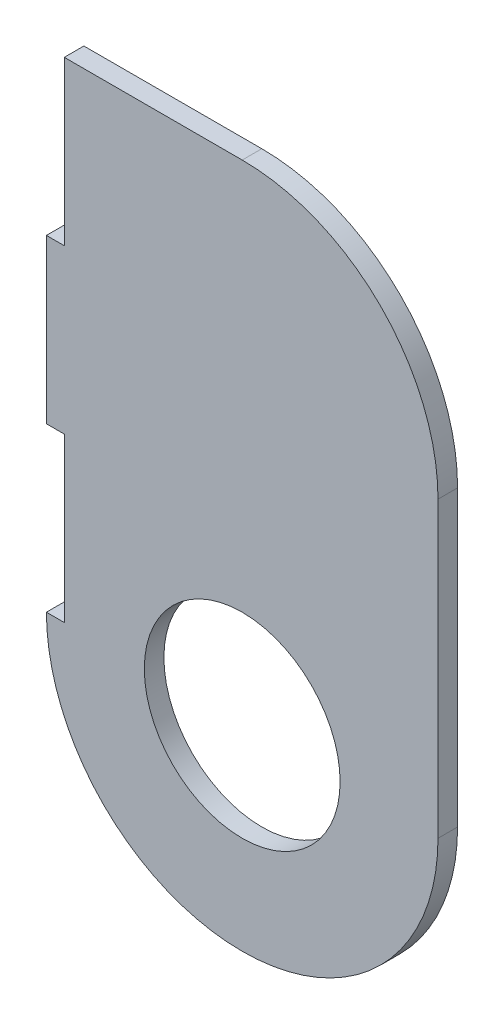
ISO-10303-21;
HEADER;
FILE_DESCRIPTION(('STEP AP214'),'2;1');
FILE_NAME('part.step','',(''),(''),'','','');
FILE_SCHEMA(('AUTOMOTIVE_DESIGN { 1 0 10303 214 1 1 1 1 }'));
ENDSEC;
DATA;
#1=APPLICATION_CONTEXT('core data for automotive mechanical design processes');
#2=APPLICATION_PROTOCOL_DEFINITION('international standard','automotive_design',2000,#1);
#3=PRODUCT_CONTEXT('',#1,'mechanical');
#4=PRODUCT('Part','Part','',(#3));
#5=PRODUCT_RELATED_PRODUCT_CATEGORY('part','',(#4));
#6=PRODUCT_DEFINITION_FORMATION('','',#4);
#7=PRODUCT_DEFINITION_CONTEXT('part definition',#1,'design');
#8=PRODUCT_DEFINITION('design','',#6,#7);
#9=PRODUCT_DEFINITION_SHAPE('','',#8);
#10=(LENGTH_UNIT() NAMED_UNIT(*) SI_UNIT(.MILLI.,.METRE.));
#11=(NAMED_UNIT(*) PLANE_ANGLE_UNIT() SI_UNIT($,.RADIAN.));
#12=(NAMED_UNIT(*) SI_UNIT($,.STERADIAN.) SOLID_ANGLE_UNIT());
#13=UNCERTAINTY_MEASURE_WITH_UNIT(LENGTH_MEASURE(1.E-05),#10,'distance_accuracy_value','');
#14=(GEOMETRIC_REPRESENTATION_CONTEXT(3) GLOBAL_UNCERTAINTY_ASSIGNED_CONTEXT((#13)) GLOBAL_UNIT_ASSIGNED_CONTEXT((#10,
#11,#12)) REPRESENTATION_CONTEXT('',''));
#15=CARTESIAN_POINT('',(0.,0.,0.));
#16=DIRECTION('',(0.,0.,1.));
#17=DIRECTION('',(1.,0.,0.));
#18=AXIS2_PLACEMENT_3D('',#15,#16,#17);
#19=CARTESIAN_POINT('',(0.,0.,3.));
#20=DIRECTION('',(1.,0.,0.));
#21=DIRECTION('',(0.,0.,-1.));
#22=AXIS2_PLACEMENT_3D('',#19,#20,#21);
#23=PLANE('',#22);
#24=DIRECTION('',(0.,-1.,0.));
#25=VECTOR('',#24,1.);
#26=CARTESIAN_POINT('',(0.,0.,0.));
#27=LINE('',#26,#25);
#28=CARTESIAN_POINT('',(0.,80.,0.));
#29=VERTEX_POINT('',#28);
#30=CARTESIAN_POINT('',(0.,55.,0.));
#31=VERTEX_POINT('',#30);
#32=EDGE_CURVE('E197',#29,#31,#27,.T.);
#33=ORIENTED_EDGE('',*,*,#32,.T.);
#34=DIRECTION('',(0.,0.,1.));
#35=VECTOR('',#34,1.);
#36=CARTESIAN_POINT('',(0.,55.,0.));
#37=LINE('',#36,#35);
#38=CARTESIAN_POINT('',(0.,55.,3.));
#39=VERTEX_POINT('',#38);
#40=EDGE_CURVE('E159',#31,#39,#37,.T.);
#41=ORIENTED_EDGE('',*,*,#40,.T.);
#42=DIRECTION('',(0.,-1.,0.));
#43=VECTOR('',#42,1.);
#44=CARTESIAN_POINT('',(0.,0.,3.));
#45=LINE('',#44,#43);
#46=CARTESIAN_POINT('',(0.,80.,3.));
#47=VERTEX_POINT('',#46);
#48=EDGE_CURVE('E188',#47,#39,#45,.T.);
#49=ORIENTED_EDGE('',*,*,#48,.F.);
#50=DIRECTION('',(0.,0.,1.));
#51=VECTOR('',#50,1.);
#52=CARTESIAN_POINT('',(0.,80.,0.));
#53=LINE('',#52,#51);
#54=EDGE_CURVE('E164',#29,#47,#53,.T.);
#55=ORIENTED_EDGE('',*,*,#54,.F.);
#56=EDGE_LOOP('',(#33,#41,#49,#55));
#57=FACE_BOUND('',#56,.T.);
#58=ADVANCED_FACE('F43',(#57),#23,.F.);
#59=CARTESIAN_POINT('',(60.,0.,3.));
#60=DIRECTION('',(-1.,0.,0.));
#61=DIRECTION('',(0.,0.,1.));
#62=AXIS2_PLACEMENT_3D('',#59,#60,#61);
#63=PLANE('',#62);
#64=DIRECTION('',(0.,1.,0.));
#65=VECTOR('',#64,1.);
#66=CARTESIAN_POINT('',(60.,0.,0.));
#67=LINE('',#66,#65);
#68=CARTESIAN_POINT('',(60.,30.,0.));
#69=VERTEX_POINT('',#68);
#70=CARTESIAN_POINT('',(60.,75.,0.));
#71=VERTEX_POINT('',#70);
#72=EDGE_CURVE('E200',#69,#71,#67,.T.);
#73=ORIENTED_EDGE('',*,*,#72,.T.);
#74=DIRECTION('',(0.,0.,-1.));
#75=VECTOR('',#74,1.);
#76=CARTESIAN_POINT('',(60.,75.,3.));
#77=LINE('',#76,#75);
#78=CARTESIAN_POINT('',(60.,75.,3.));
#79=VERTEX_POINT('',#78);
#80=EDGE_CURVE('E51',#71,#79,#77,.F.);
#81=ORIENTED_EDGE('',*,*,#80,.T.);
#82=DIRECTION('',(0.,1.,0.));
#83=VECTOR('',#82,1.);
#84=CARTESIAN_POINT('',(60.,0.,3.));
#85=LINE('',#84,#83);
#86=CARTESIAN_POINT('',(60.,30.,3.));
#87=VERTEX_POINT('',#86);
#88=EDGE_CURVE('E191',#87,#79,#85,.T.);
#89=ORIENTED_EDGE('',*,*,#88,.F.);
#90=DIRECTION('',(0.,0.,-1.));
#91=VECTOR('',#90,1.);
#92=CARTESIAN_POINT('',(60.,30.,3.));
#93=LINE('',#92,#91);
#94=EDGE_CURVE('E196',#87,#69,#93,.T.);
#95=ORIENTED_EDGE('',*,*,#94,.T.);
#96=EDGE_LOOP('',(#73,#81,#89,#95));
#97=FACE_BOUND('',#96,.T.);
#98=ADVANCED_FACE('F245',(#97),#63,.F.);
#99=CARTESIAN_POINT('',(0.,105.,3.));
#100=DIRECTION('',(0.,-1.,0.));
#101=DIRECTION('',(0.,0.,-1.));
#102=AXIS2_PLACEMENT_3D('',#99,#100,#101);
#103=PLANE('',#102);
#104=DIRECTION('',(-1.,0.,0.));
#105=VECTOR('',#104,1.);
#106=CARTESIAN_POINT('',(0.,105.,3.));
#107=LINE('',#106,#105);
#108=CARTESIAN_POINT('',(30.,105.,3.));
#109=VERTEX_POINT('',#108);
#110=CARTESIAN_POINT('',(2.74025674074846,105.,3.));
#111=VERTEX_POINT('',#110);
#112=EDGE_CURVE('E194',#109,#111,#107,.T.);
#113=ORIENTED_EDGE('',*,*,#112,.F.);
#114=DIRECTION('',(0.,0.,-1.));
#115=VECTOR('',#114,1.);
#116=CARTESIAN_POINT('',(30.,105.,3.));
#117=LINE('',#116,#115);
#118=CARTESIAN_POINT('',(30.,105.,0.));
#119=VERTEX_POINT('',#118);
#120=EDGE_CURVE('E214',#109,#119,#117,.T.);
#121=ORIENTED_EDGE('',*,*,#120,.T.);
#122=DIRECTION('',(-1.,0.,0.));
#123=VECTOR('',#122,1.);
#124=CARTESIAN_POINT('',(0.,105.,0.));
#125=LINE('',#124,#123);
#126=CARTESIAN_POINT('',(2.74025674074846,105.,0.));
#127=VERTEX_POINT('',#126);
#128=EDGE_CURVE('E192',#119,#127,#125,.T.);
#129=ORIENTED_EDGE('',*,*,#128,.T.);
#130=DIRECTION('',(0.,0.,1.));
#131=VECTOR('',#130,1.);
#132=CARTESIAN_POINT('',(2.74025674074846,105.,0.));
#133=LINE('',#132,#131);
#134=EDGE_CURVE('E169',#127,#111,#133,.T.);
#135=ORIENTED_EDGE('',*,*,#134,.T.);
#136=EDGE_LOOP('',(#113,#121,#129,#135));
#137=FACE_BOUND('',#136,.T.);
#138=ADVANCED_FACE('F222',(#137),#103,.F.);
#139=CARTESIAN_POINT('',(0.,0.,3.));
#140=DIRECTION('',(0.,0.,-1.));
#141=DIRECTION('',(-1.,0.,0.));
#142=AXIS2_PLACEMENT_3D('',#139,#140,#141);
#143=PLANE('',#142);
#144=CARTESIAN_POINT('',(30.,30.,3.));
#145=DIRECTION('',(0.,0.,1.));
#146=DIRECTION('',(1.,0.,0.));
#147=AXIS2_PLACEMENT_3D('',#144,#145,#146);
#148=CIRCLE('',#147,15.);
#149=CARTESIAN_POINT('',(45.,30.,3.));
#150=VERTEX_POINT('',#149);
#151=EDGE_CURVE('E162',#150,#150,#148,.T.);
#152=ORIENTED_EDGE('',*,*,#151,.F.);
#153=EDGE_LOOP('',(#152));
#154=FACE_BOUND('',#153,.T.);
#155=ORIENTED_EDGE('',*,*,#88,.T.);
#156=CARTESIAN_POINT('',(30.,75.,3.));
#157=DIRECTION('',(0.,0.,-1.));
#158=DIRECTION('',(-1.,0.,0.));
#159=AXIS2_PLACEMENT_3D('',#156,#157,#158);
#160=CIRCLE('',#159,30.);
#161=EDGE_CURVE('E11',#79,#109,#160,.F.);
#162=ORIENTED_EDGE('',*,*,#161,.T.);
#163=ORIENTED_EDGE('',*,*,#112,.T.);
#164=DIRECTION('',(0.,1.,0.));
#165=VECTOR('',#164,1.);
#166=CARTESIAN_POINT('',(2.74025674074846,80.,3.));
#167=LINE('',#166,#165);
#168=CARTESIAN_POINT('',(2.74025674074846,80.,3.));
#169=VERTEX_POINT('',#168);
#170=EDGE_CURVE('E172',#169,#111,#167,.T.);
#171=ORIENTED_EDGE('',*,*,#170,.F.);
#172=DIRECTION('',(1.,0.,0.));
#173=VECTOR('',#172,1.);
#174=CARTESIAN_POINT('',(0.,80.,3.));
#175=LINE('',#174,#173);
#176=EDGE_CURVE('E157',#47,#169,#175,.T.);
#177=ORIENTED_EDGE('',*,*,#176,.F.);
#178=ORIENTED_EDGE('',*,*,#48,.T.);
#179=DIRECTION('',(-1.,0.,0.));
#180=VECTOR('',#179,1.);
#181=CARTESIAN_POINT('',(0.,55.,3.));
#182=LINE('',#181,#180);
#183=CARTESIAN_POINT('',(2.74025674074846,55.,3.));
#184=VERTEX_POINT('',#183);
#185=EDGE_CURVE('E150',#184,#39,#182,.T.);
#186=ORIENTED_EDGE('',*,*,#185,.F.);
#187=DIRECTION('',(0.,1.,0.));
#188=VECTOR('',#187,1.);
#189=CARTESIAN_POINT('',(2.74025674074846,30.,3.));
#190=LINE('',#189,#188);
#191=CARTESIAN_POINT('',(2.74025674074846,30.,3.));
#192=VERTEX_POINT('',#191);
#193=EDGE_CURVE('E152',#192,#184,#190,.T.);
#194=ORIENTED_EDGE('',*,*,#193,.F.);
#195=DIRECTION('',(1.,0.,0.));
#196=VECTOR('',#195,1.);
#197=CARTESIAN_POINT('',(0.,30.,3.));
#198=LINE('',#197,#196);
#199=CARTESIAN_POINT('',(0.,30.,3.));
#200=VERTEX_POINT('',#199);
#201=EDGE_CURVE('E132',#200,#192,#198,.T.);
#202=ORIENTED_EDGE('',*,*,#201,.F.);
#203=CARTESIAN_POINT('',(30.,30.,3.));
#204=DIRECTION('',(0.,0.,-1.));
#205=DIRECTION('',(-1.,0.,0.));
#206=AXIS2_PLACEMENT_3D('',#203,#204,#205);
#207=CIRCLE('',#206,30.);
#208=CARTESIAN_POINT('',(30.,0.,3.));
#209=VERTEX_POINT('',#208);
#210=EDGE_CURVE('E208',#200,#209,#207,.F.);
#211=ORIENTED_EDGE('',*,*,#210,.T.);
#212=CARTESIAN_POINT('',(30.,30.,3.));
#213=DIRECTION('',(0.,0.,-1.));
#214=DIRECTION('',(-1.,0.,0.));
#215=AXIS2_PLACEMENT_3D('',#212,#213,#214);
#216=CIRCLE('',#215,30.);
#217=EDGE_CURVE('E210',#209,#87,#216,.F.);
#218=ORIENTED_EDGE('',*,*,#217,.T.);
#219=EDGE_LOOP('',(#155,#162,#163,#171,#177,#178,#186,#194,#202,#211,#218));
#220=FACE_BOUND('',#219,.T.);
#221=ADVANCED_FACE('F237',(#154,#220),#143,.F.);
#222=CARTESIAN_POINT('',(0.,0.,0.));
#223=DIRECTION('',(0.,0.,-1.));
#224=DIRECTION('',(-1.,0.,0.));
#225=AXIS2_PLACEMENT_3D('',#222,#223,#224);
#226=PLANE('',#225);
#227=ORIENTED_EDGE('',*,*,#128,.F.);
#228=CARTESIAN_POINT('',(30.,75.,0.));
#229=DIRECTION('',(0.,0.,-1.));
#230=DIRECTION('',(-1.,0.,0.));
#231=AXIS2_PLACEMENT_3D('',#228,#229,#230);
#232=CIRCLE('',#231,30.);
#233=EDGE_CURVE('E65',#119,#71,#232,.T.);
#234=ORIENTED_EDGE('',*,*,#233,.T.);
#235=ORIENTED_EDGE('',*,*,#72,.F.);
#236=CARTESIAN_POINT('',(30.,30.,0.));
#237=DIRECTION('',(0.,0.,-1.));
#238=DIRECTION('',(-1.,0.,0.));
#239=AXIS2_PLACEMENT_3D('',#236,#237,#238);
#240=CIRCLE('',#239,30.);
#241=CARTESIAN_POINT('',(30.,0.,0.));
#242=VERTEX_POINT('',#241);
#243=EDGE_CURVE('E206',#69,#242,#240,.T.);
#244=ORIENTED_EDGE('',*,*,#243,.T.);
#245=CARTESIAN_POINT('',(30.,30.,0.));
#246=DIRECTION('',(0.,0.,-1.));
#247=DIRECTION('',(-1.,0.,0.));
#248=AXIS2_PLACEMENT_3D('',#245,#246,#247);
#249=CIRCLE('',#248,30.);
#250=CARTESIAN_POINT('',(0.,30.,0.));
#251=VERTEX_POINT('',#250);
#252=EDGE_CURVE('E148',#242,#251,#249,.T.);
#253=ORIENTED_EDGE('',*,*,#252,.T.);
#254=DIRECTION('',(1.,0.,0.));
#255=VECTOR('',#254,1.);
#256=CARTESIAN_POINT('',(0.,30.,0.));
#257=LINE('',#256,#255);
#258=CARTESIAN_POINT('',(2.74025674074846,30.,0.));
#259=VERTEX_POINT('',#258);
#260=EDGE_CURVE('E129',#251,#259,#257,.T.);
#261=ORIENTED_EDGE('',*,*,#260,.T.);
#262=DIRECTION('',(0.,1.,0.));
#263=VECTOR('',#262,1.);
#264=CARTESIAN_POINT('',(2.74025674074846,30.,0.));
#265=LINE('',#264,#263);
#266=CARTESIAN_POINT('',(2.74025674074846,55.,0.));
#267=VERTEX_POINT('',#266);
#268=EDGE_CURVE('E140',#259,#267,#265,.T.);
#269=ORIENTED_EDGE('',*,*,#268,.T.);
#270=DIRECTION('',(-1.,0.,0.));
#271=VECTOR('',#270,1.);
#272=CARTESIAN_POINT('',(0.,55.,0.));
#273=LINE('',#272,#271);
#274=EDGE_CURVE('E137',#267,#31,#273,.T.);
#275=ORIENTED_EDGE('',*,*,#274,.T.);
#276=ORIENTED_EDGE('',*,*,#32,.F.);
#277=DIRECTION('',(1.,0.,0.));
#278=VECTOR('',#277,1.);
#279=CARTESIAN_POINT('',(0.,80.,0.));
#280=LINE('',#279,#278);
#281=CARTESIAN_POINT('',(2.74025674074846,80.,0.));
#282=VERTEX_POINT('',#281);
#283=EDGE_CURVE('E175',#29,#282,#280,.T.);
#284=ORIENTED_EDGE('',*,*,#283,.T.);
#285=DIRECTION('',(0.,1.,0.));
#286=VECTOR('',#285,1.);
#287=CARTESIAN_POINT('',(2.74025674074846,80.,0.));
#288=LINE('',#287,#286);
#289=EDGE_CURVE('E166',#282,#127,#288,.T.);
#290=ORIENTED_EDGE('',*,*,#289,.T.);
#291=EDGE_LOOP('',(#227,#234,#235,#244,#253,#261,#269,#275,#276,#284,#290));
#292=FACE_BOUND('',#291,.T.);
#293=CARTESIAN_POINT('',(30.,30.,0.));
#294=DIRECTION('',(0.,0.,1.));
#295=DIRECTION('',(1.,0.,0.));
#296=AXIS2_PLACEMENT_3D('',#293,#294,#295);
#297=CIRCLE('',#296,15.);
#298=CARTESIAN_POINT('',(45.,30.,0.));
#299=VERTEX_POINT('',#298);
#300=EDGE_CURVE('E182',#299,#299,#297,.T.);
#301=ORIENTED_EDGE('',*,*,#300,.T.);
#302=EDGE_LOOP('',(#301));
#303=FACE_BOUND('',#302,.T.);
#304=ADVANCED_FACE('F145',(#292,#303),#226,.T.);
#305=CARTESIAN_POINT('',(30.,30.,3.));
#306=DIRECTION('',(0.,0.,-1.));
#307=DIRECTION('',(-1.,0.,0.));
#308=AXIS2_PLACEMENT_3D('',#305,#306,#307);
#309=CYLINDRICAL_SURFACE('',#308,30.);
#310=DIRECTION('',(0.,0.,-1.));
#311=VECTOR('',#310,1.);
#312=CARTESIAN_POINT('',(30.,0.,3.));
#313=LINE('',#312,#311);
#314=EDGE_CURVE('E185',#209,#242,#313,.T.);
#315=ORIENTED_EDGE('',*,*,#314,.F.);
#316=ORIENTED_EDGE('',*,*,#210,.F.);
#317=DIRECTION('',(0.,0.,-1.));
#318=VECTOR('',#317,1.);
#319=CARTESIAN_POINT('',(0.,30.,3.));
#320=LINE('',#319,#318);
#321=EDGE_CURVE('E212',#251,#200,#320,.F.);
#322=ORIENTED_EDGE('',*,*,#321,.F.);
#323=ORIENTED_EDGE('',*,*,#252,.F.);
#324=EDGE_LOOP('',(#315,#316,#322,#323));
#325=FACE_BOUND('',#324,.T.);
#326=ADVANCED_FACE('F259',(#325),#309,.T.);
#327=CARTESIAN_POINT('',(30.,30.,3.));
#328=DIRECTION('',(0.,0.,-1.));
#329=DIRECTION('',(-1.,0.,0.));
#330=AXIS2_PLACEMENT_3D('',#327,#328,#329);
#331=CYLINDRICAL_SURFACE('',#330,30.);
#332=ORIENTED_EDGE('',*,*,#217,.F.);
#333=ORIENTED_EDGE('',*,*,#314,.T.);
#334=ORIENTED_EDGE('',*,*,#243,.F.);
#335=ORIENTED_EDGE('',*,*,#94,.F.);
#336=EDGE_LOOP('',(#332,#333,#334,#335));
#337=FACE_BOUND('',#336,.T.);
#338=ADVANCED_FACE('F256',(#337),#331,.T.);
#339=CARTESIAN_POINT('',(30.,30.,0.));
#340=DIRECTION('',(0.,0.,1.));
#341=DIRECTION('',(1.,0.,0.));
#342=AXIS2_PLACEMENT_3D('',#339,#340,#341);
#343=CYLINDRICAL_SURFACE('',#342,15.);
#344=ORIENTED_EDGE('',*,*,#300,.F.);
#345=EDGE_LOOP('',(#344));
#346=FACE_BOUND('',#345,.T.);
#347=ORIENTED_EDGE('',*,*,#151,.T.);
#348=EDGE_LOOP('',(#347));
#349=FACE_BOUND('',#348,.T.);
#350=ADVANCED_FACE('F258',(#346,#349),#343,.F.);
#351=CARTESIAN_POINT('',(0.,55.,0.));
#352=DIRECTION('',(0.,1.,0.));
#353=DIRECTION('',(0.,0.,1.));
#354=AXIS2_PLACEMENT_3D('',#351,#352,#353);
#355=PLANE('',#354);
#356=ORIENTED_EDGE('',*,*,#185,.T.);
#357=ORIENTED_EDGE('',*,*,#40,.F.);
#358=ORIENTED_EDGE('',*,*,#274,.F.);
#359=DIRECTION('',(0.,0.,1.));
#360=VECTOR('',#359,1.);
#361=CARTESIAN_POINT('',(2.74025674074846,55.,0.));
#362=LINE('',#361,#360);
#363=EDGE_CURVE('E136',#267,#184,#362,.T.);
#364=ORIENTED_EDGE('',*,*,#363,.T.);
#365=EDGE_LOOP('',(#356,#357,#358,#364));
#366=FACE_BOUND('',#365,.T.);
#367=ADVANCED_FACE('F272',(#366),#355,.F.);
#368=CARTESIAN_POINT('',(2.74025674074846,30.,0.));
#369=DIRECTION('',(1.,0.,0.));
#370=DIRECTION('',(0.,0.,-1.));
#371=AXIS2_PLACEMENT_3D('',#368,#369,#370);
#372=PLANE('',#371);
#373=ORIENTED_EDGE('',*,*,#193,.T.);
#374=ORIENTED_EDGE('',*,*,#363,.F.);
#375=ORIENTED_EDGE('',*,*,#268,.F.);
#376=DIRECTION('',(0.,0.,1.));
#377=VECTOR('',#376,1.);
#378=CARTESIAN_POINT('',(2.74025674074846,30.,0.));
#379=LINE('',#378,#377);
#380=EDGE_CURVE('E125',#259,#192,#379,.T.);
#381=ORIENTED_EDGE('',*,*,#380,.T.);
#382=EDGE_LOOP('',(#373,#374,#375,#381));
#383=FACE_BOUND('',#382,.T.);
#384=ADVANCED_FACE('F141',(#383),#372,.F.);
#385=CARTESIAN_POINT('',(0.,30.,0.));
#386=DIRECTION('',(0.,-1.,0.));
#387=DIRECTION('',(0.,0.,-1.));
#388=AXIS2_PLACEMENT_3D('',#385,#386,#387);
#389=PLANE('',#388);
#390=ORIENTED_EDGE('',*,*,#201,.T.);
#391=ORIENTED_EDGE('',*,*,#380,.F.);
#392=ORIENTED_EDGE('',*,*,#260,.F.);
#393=ORIENTED_EDGE('',*,*,#321,.T.);
#394=EDGE_LOOP('',(#390,#391,#392,#393));
#395=FACE_BOUND('',#394,.T.);
#396=ADVANCED_FACE('F127',(#395),#389,.F.);
#397=CARTESIAN_POINT('',(2.74025674074846,80.,0.));
#398=DIRECTION('',(1.,0.,0.));
#399=DIRECTION('',(0.,0.,-1.));
#400=AXIS2_PLACEMENT_3D('',#397,#398,#399);
#401=PLANE('',#400);
#402=ORIENTED_EDGE('',*,*,#170,.T.);
#403=ORIENTED_EDGE('',*,*,#134,.F.);
#404=ORIENTED_EDGE('',*,*,#289,.F.);
#405=DIRECTION('',(0.,0.,1.));
#406=VECTOR('',#405,1.);
#407=CARTESIAN_POINT('',(2.74025674074846,80.,0.));
#408=LINE('',#407,#406);
#409=EDGE_CURVE('E167',#282,#169,#408,.T.);
#410=ORIENTED_EDGE('',*,*,#409,.T.);
#411=EDGE_LOOP('',(#402,#403,#404,#410));
#412=FACE_BOUND('',#411,.T.);
#413=ADVANCED_FACE('F229',(#412),#401,.F.);
#414=CARTESIAN_POINT('',(0.,80.,0.));
#415=DIRECTION('',(0.,-1.,0.));
#416=DIRECTION('',(0.,0.,-1.));
#417=AXIS2_PLACEMENT_3D('',#414,#415,#416);
#418=PLANE('',#417);
#419=ORIENTED_EDGE('',*,*,#176,.T.);
#420=ORIENTED_EDGE('',*,*,#409,.F.);
#421=ORIENTED_EDGE('',*,*,#283,.F.);
#422=ORIENTED_EDGE('',*,*,#54,.T.);
#423=EDGE_LOOP('',(#419,#420,#421,#422));
#424=FACE_BOUND('',#423,.T.);
#425=ADVANCED_FACE('F231',(#424),#418,.F.);
#426=CARTESIAN_POINT('',(30.,75.,3.));
#427=DIRECTION('',(0.,0.,-1.));
#428=DIRECTION('',(-1.,0.,0.));
#429=AXIS2_PLACEMENT_3D('',#426,#427,#428);
#430=CYLINDRICAL_SURFACE('',#429,30.);
#431=ORIENTED_EDGE('',*,*,#161,.F.);
#432=ORIENTED_EDGE('',*,*,#80,.F.);
#433=ORIENTED_EDGE('',*,*,#233,.F.);
#434=ORIENTED_EDGE('',*,*,#120,.F.);
#435=EDGE_LOOP('',(#431,#432,#433,#434));
#436=FACE_BOUND('',#435,.T.);
#437=ADVANCED_FACE('F45',(#436),#430,.T.);
#438=CLOSED_SHELL('',(#58,#98,#138,#221,#304,#326,#338,#350,#367,#384,#396,#413,#425,#437));
#439=MANIFOLD_SOLID_BREP('B2',#438);
#440=ADVANCED_BREP_SHAPE_REPRESENTATION('',(#18,#439),#14);
#441=SHAPE_DEFINITION_REPRESENTATION(#9,#440);
ENDSEC;
END-ISO-10303-21;
